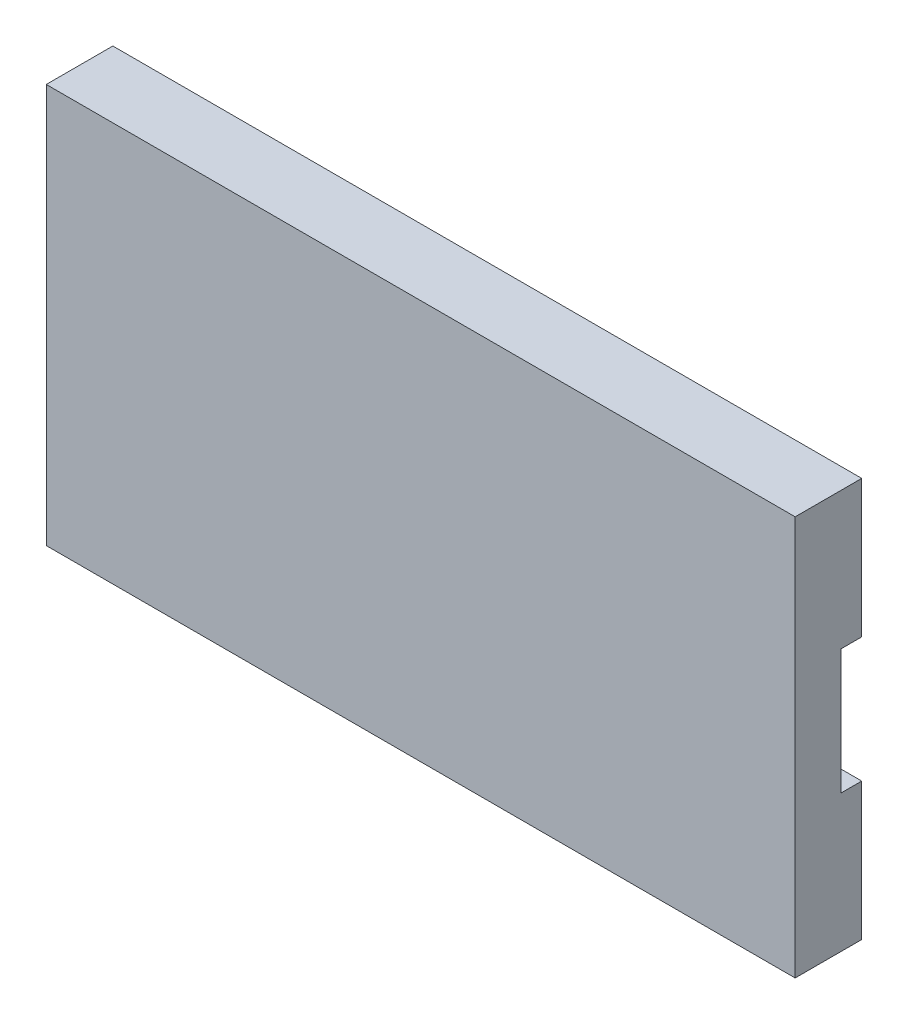
ISO-10303-21;
HEADER;
FILE_DESCRIPTION(('STEP AP214'),'2;1');
FILE_NAME('part.step','',(''),(''),'','','');
FILE_SCHEMA(('AUTOMOTIVE_DESIGN { 1 0 10303 214 1 1 1 1 }'));
ENDSEC;
DATA;
#1=APPLICATION_CONTEXT('core data for automotive mechanical design processes');
#2=APPLICATION_PROTOCOL_DEFINITION('international standard','automotive_design',2000,#1);
#3=PRODUCT_CONTEXT('',#1,'mechanical');
#4=PRODUCT('Part','Part','',(#3));
#5=PRODUCT_RELATED_PRODUCT_CATEGORY('part','',(#4));
#6=PRODUCT_DEFINITION_FORMATION('','',#4);
#7=PRODUCT_DEFINITION_CONTEXT('part definition',#1,'design');
#8=PRODUCT_DEFINITION('design','',#6,#7);
#9=PRODUCT_DEFINITION_SHAPE('','',#8);
#10=(LENGTH_UNIT() NAMED_UNIT(*) SI_UNIT(.MILLI.,.METRE.));
#11=(NAMED_UNIT(*) PLANE_ANGLE_UNIT() SI_UNIT($,.RADIAN.));
#12=(NAMED_UNIT(*) SI_UNIT($,.STERADIAN.) SOLID_ANGLE_UNIT());
#13=UNCERTAINTY_MEASURE_WITH_UNIT(LENGTH_MEASURE(1.E-05),#10,'distance_accuracy_value','');
#14=(GEOMETRIC_REPRESENTATION_CONTEXT(3) GLOBAL_UNCERTAINTY_ASSIGNED_CONTEXT((#13)) GLOBAL_UNIT_ASSIGNED_CONTEXT((#10,
#11,#12)) REPRESENTATION_CONTEXT('',''));
#15=CARTESIAN_POINT('',(0.,0.,0.));
#16=DIRECTION('',(0.,0.,1.));
#17=DIRECTION('',(1.,0.,0.));
#18=AXIS2_PLACEMENT_3D('',#15,#16,#17);
#19=CARTESIAN_POINT('',(45.,24.,8.));
#20=DIRECTION('',(1.,0.,0.));
#21=DIRECTION('',(0.,0.,-1.));
#22=AXIS2_PLACEMENT_3D('',#19,#20,#21);
#23=PLANE('',#22);
#24=DIRECTION('',(0.,-1.,0.));
#25=VECTOR('',#24,1.);
#26=CARTESIAN_POINT('',(45.,24.,0.));
#27=LINE('',#26,#25);
#28=CARTESIAN_POINT('',(45.,-7.49999999999999,0.));
#29=VERTEX_POINT('',#28);
#30=CARTESIAN_POINT('',(45.,-24.,0.));
#31=VERTEX_POINT('',#30);
#32=EDGE_CURVE('E236',#29,#31,#27,.T.);
#33=ORIENTED_EDGE('',*,*,#32,.F.);
#34=DIRECTION('',(0.,0.,1.));
#35=VECTOR('',#34,1.);
#36=CARTESIAN_POINT('',(45.,-7.49999999999999,8.));
#37=LINE('',#36,#35);
#38=CARTESIAN_POINT('',(45.,-7.49999999999999,2.5));
#39=VERTEX_POINT('',#38);
#40=EDGE_CURVE('E162',#29,#39,#37,.T.);
#41=ORIENTED_EDGE('',*,*,#40,.T.);
#42=DIRECTION('',(0.,-1.,0.));
#43=VECTOR('',#42,1.);
#44=CARTESIAN_POINT('',(45.,24.,2.5));
#45=LINE('',#44,#43);
#46=CARTESIAN_POINT('',(45.,7.50000000000001,2.5));
#47=VERTEX_POINT('',#46);
#48=EDGE_CURVE('E11',#47,#39,#45,.T.);
#49=ORIENTED_EDGE('',*,*,#48,.F.);
#50=DIRECTION('',(0.,0.,-1.));
#51=VECTOR('',#50,1.);
#52=CARTESIAN_POINT('',(45.,7.50000000000001,8.));
#53=LINE('',#52,#51);
#54=CARTESIAN_POINT('',(45.,7.50000000000001,0.));
#55=VERTEX_POINT('',#54);
#56=EDGE_CURVE('E139',#47,#55,#53,.T.);
#57=ORIENTED_EDGE('',*,*,#56,.T.);
#58=CARTESIAN_POINT('',(45.,24.,0.));
#59=VERTEX_POINT('',#58);
#60=EDGE_CURVE('E237',#59,#55,#27,.T.);
#61=ORIENTED_EDGE('',*,*,#60,.F.);
#62=DIRECTION('',(0.,0.,-1.));
#63=VECTOR('',#62,1.);
#64=CARTESIAN_POINT('',(45.,24.,8.));
#65=LINE('',#64,#63);
#66=CARTESIAN_POINT('',(45.,24.,8.));
#67=VERTEX_POINT('',#66);
#68=EDGE_CURVE('E243',#67,#59,#65,.T.);
#69=ORIENTED_EDGE('',*,*,#68,.F.);
#70=DIRECTION('',(0.,-1.,0.));
#71=VECTOR('',#70,1.);
#72=CARTESIAN_POINT('',(45.,24.,8.));
#73=LINE('',#72,#71);
#74=CARTESIAN_POINT('',(45.,-24.,8.));
#75=VERTEX_POINT('',#74);
#76=EDGE_CURVE('E223',#67,#75,#73,.T.);
#77=ORIENTED_EDGE('',*,*,#76,.T.);
#78=DIRECTION('',(0.,0.,-1.));
#79=VECTOR('',#78,1.);
#80=CARTESIAN_POINT('',(45.,-24.,8.));
#81=LINE('',#80,#79);
#82=EDGE_CURVE('E245',#75,#31,#81,.T.);
#83=ORIENTED_EDGE('',*,*,#82,.T.);
#84=EDGE_LOOP('',(#33,#41,#49,#57,#61,#69,#77,#83));
#85=FACE_BOUND('',#84,.T.);
#86=ADVANCED_FACE('F44',(#85),#23,.T.);
#87=CARTESIAN_POINT('',(0.,0.,0.));
#88=DIRECTION('',(0.,0.,1.));
#89=DIRECTION('',(1.,0.,0.));
#90=AXIS2_PLACEMENT_3D('',#87,#88,#89);
#91=PLANE('',#90);
#92=CARTESIAN_POINT('',(0.,0.,0.));
#93=DIRECTION('',(0.,0.,-1.));
#94=DIRECTION('',(-1.,0.,0.));
#95=AXIS2_PLACEMENT_3D('',#92,#93,#94);
#96=CIRCLE('',#95,15.);
#97=CARTESIAN_POINT('',(-15.,0.,0.));
#98=VERTEX_POINT('',#97);
#99=EDGE_CURVE('E208',#98,#98,#96,.T.);
#100=ORIENTED_EDGE('',*,*,#99,.F.);
#101=EDGE_LOOP('',(#100));
#102=FACE_BOUND('',#101,.T.);
#103=CARTESIAN_POINT('',(41.,21.,0.));
#104=DIRECTION('',(0.,0.,-1.));
#105=DIRECTION('',(-1.,0.,0.));
#106=AXIS2_PLACEMENT_3D('',#103,#104,#105);
#107=CIRCLE('',#106,1.8);
#108=CARTESIAN_POINT('',(39.2,21.,0.));
#109=VERTEX_POINT('',#108);
#110=EDGE_CURVE('E202',#109,#109,#107,.T.);
#111=ORIENTED_EDGE('',*,*,#110,.F.);
#112=EDGE_LOOP('',(#111));
#113=FACE_BOUND('',#112,.T.);
#114=CARTESIAN_POINT('',(41.,-21.,0.));
#115=DIRECTION('',(0.,0.,1.));
#116=DIRECTION('',(-1.,0.,0.));
#117=AXIS2_PLACEMENT_3D('',#114,#115,#116);
#118=CIRCLE('',#117,1.8);
#119=CARTESIAN_POINT('',(39.2,-21.,0.));
#120=VERTEX_POINT('',#119);
#121=EDGE_CURVE('E196',#120,#120,#118,.T.);
#122=ORIENTED_EDGE('',*,*,#121,.T.);
#123=EDGE_LOOP('',(#122));
#124=FACE_BOUND('',#123,.T.);
#125=CARTESIAN_POINT('',(-41.,-21.,0.));
#126=DIRECTION('',(0.,0.,-1.));
#127=DIRECTION('',(1.,0.,0.));
#128=AXIS2_PLACEMENT_3D('',#125,#126,#127);
#129=CIRCLE('',#128,1.8);
#130=CARTESIAN_POINT('',(-39.2,-21.,0.));
#131=VERTEX_POINT('',#130);
#132=EDGE_CURVE('E190',#131,#131,#129,.T.);
#133=ORIENTED_EDGE('',*,*,#132,.F.);
#134=EDGE_LOOP('',(#133));
#135=FACE_BOUND('',#134,.T.);
#136=CARTESIAN_POINT('',(-41.,21.,0.));
#137=DIRECTION('',(0.,0.,1.));
#138=DIRECTION('',(1.,0.,0.));
#139=AXIS2_PLACEMENT_3D('',#136,#137,#138);
#140=CIRCLE('',#139,1.8);
#141=CARTESIAN_POINT('',(-39.2,21.,0.));
#142=VERTEX_POINT('',#141);
#143=EDGE_CURVE('E186',#142,#142,#140,.T.);
#144=ORIENTED_EDGE('',*,*,#143,.T.);
#145=EDGE_LOOP('',(#144));
#146=FACE_BOUND('',#145,.T.);
#147=DIRECTION('',(1.,0.,0.));
#148=VECTOR('',#147,1.);
#149=CARTESIAN_POINT('',(53.,-7.49999999999998,0.));
#150=LINE('',#149,#148);
#151=CARTESIAN_POINT('',(37.,-7.49999999999999,0.));
#152=VERTEX_POINT('',#151);
#153=EDGE_CURVE('E153',#152,#29,#150,.T.);
#154=ORIENTED_EDGE('',*,*,#153,.T.);
#155=ORIENTED_EDGE('',*,*,#32,.T.);
#156=DIRECTION('',(1.,0.,0.));
#157=VECTOR('',#156,1.);
#158=CARTESIAN_POINT('',(-45.,-24.,0.));
#159=LINE('',#158,#157);
#160=CARTESIAN_POINT('',(-45.,-24.,0.));
#161=VERTEX_POINT('',#160);
#162=EDGE_CURVE('E233',#161,#31,#159,.T.);
#163=ORIENTED_EDGE('',*,*,#162,.F.);
#164=DIRECTION('',(0.,-1.,0.));
#165=VECTOR('',#164,1.);
#166=CARTESIAN_POINT('',(-45.,24.,0.));
#167=LINE('',#166,#165);
#168=CARTESIAN_POINT('',(-45.,-7.5,0.));
#169=VERTEX_POINT('',#168);
#170=EDGE_CURVE('E214',#169,#161,#167,.T.);
#171=ORIENTED_EDGE('',*,*,#170,.F.);
#172=DIRECTION('',(-1.,0.,0.));
#173=VECTOR('',#172,1.);
#174=CARTESIAN_POINT('',(-53.,-7.5,0.));
#175=LINE('',#174,#173);
#176=CARTESIAN_POINT('',(-37.,-7.5,0.));
#177=VERTEX_POINT('',#176);
#178=EDGE_CURVE('E169',#177,#169,#175,.T.);
#179=ORIENTED_EDGE('',*,*,#178,.F.);
#180=DIRECTION('',(0.,-1.,0.));
#181=VECTOR('',#180,1.);
#182=CARTESIAN_POINT('',(-37.,7.5,0.));
#183=LINE('',#182,#181);
#184=CARTESIAN_POINT('',(-37.,7.5,0.));
#185=VERTEX_POINT('',#184);
#186=EDGE_CURVE('E67',#185,#177,#183,.T.);
#187=ORIENTED_EDGE('',*,*,#186,.F.);
#188=DIRECTION('',(-1.,0.,0.));
#189=VECTOR('',#188,1.);
#190=CARTESIAN_POINT('',(0.,7.49999999999999,0.));
#191=LINE('',#190,#189);
#192=CARTESIAN_POINT('',(-45.,7.5,0.));
#193=VERTEX_POINT('',#192);
#194=EDGE_CURVE('E251',#185,#193,#191,.T.);
#195=ORIENTED_EDGE('',*,*,#194,.T.);
#196=CARTESIAN_POINT('',(-45.,24.,0.));
#197=VERTEX_POINT('',#196);
#198=EDGE_CURVE('E230',#197,#193,#167,.T.);
#199=ORIENTED_EDGE('',*,*,#198,.F.);
#200=DIRECTION('',(1.,0.,0.));
#201=VECTOR('',#200,1.);
#202=CARTESIAN_POINT('',(-45.,24.,0.));
#203=LINE('',#202,#201);
#204=EDGE_CURVE('E221',#197,#59,#203,.T.);
#205=ORIENTED_EDGE('',*,*,#204,.T.);
#206=ORIENTED_EDGE('',*,*,#60,.T.);
#207=DIRECTION('',(1.,0.,0.));
#208=VECTOR('',#207,1.);
#209=CARTESIAN_POINT('',(0.,7.49999999999999,0.));
#210=LINE('',#209,#208);
#211=CARTESIAN_POINT('',(37.,7.50000000000001,0.));
#212=VERTEX_POINT('',#211);
#213=EDGE_CURVE('E52',#212,#55,#210,.T.);
#214=ORIENTED_EDGE('',*,*,#213,.F.);
#215=DIRECTION('',(0.,-1.,0.));
#216=VECTOR('',#215,1.);
#217=CARTESIAN_POINT('',(37.,7.50000000000001,0.));
#218=LINE('',#217,#216);
#219=EDGE_CURVE('E59',#212,#152,#218,.T.);
#220=ORIENTED_EDGE('',*,*,#219,.T.);
#221=EDGE_LOOP('',(#154,#155,#163,#171,#179,#187,#195,#199,#205,#206,#214,#220));
#222=FACE_BOUND('',#221,.T.);
#223=ADVANCED_FACE('F260',(#102,#113,#124,#135,#146,#222),#91,.F.);
#224=CARTESIAN_POINT('',(-45.,24.,8.));
#225=DIRECTION('',(1.,0.,0.));
#226=DIRECTION('',(0.,1.,0.));
#227=AXIS2_PLACEMENT_3D('',#224,#225,#226);
#228=PLANE('',#227);
#229=ORIENTED_EDGE('',*,*,#198,.T.);
#230=DIRECTION('',(0.,0.,1.));
#231=VECTOR('',#230,1.);
#232=CARTESIAN_POINT('',(-45.,7.5,8.));
#233=LINE('',#232,#231);
#234=CARTESIAN_POINT('',(-45.,7.5,2.5));
#235=VERTEX_POINT('',#234);
#236=EDGE_CURVE('E183',#193,#235,#233,.T.);
#237=ORIENTED_EDGE('',*,*,#236,.T.);
#238=DIRECTION('',(0.,-1.,0.));
#239=VECTOR('',#238,1.);
#240=CARTESIAN_POINT('',(-45.,24.,2.5));
#241=LINE('',#240,#239);
#242=CARTESIAN_POINT('',(-45.,-7.5,2.5));
#243=VERTEX_POINT('',#242);
#244=EDGE_CURVE('E254',#235,#243,#241,.T.);
#245=ORIENTED_EDGE('',*,*,#244,.T.);
#246=DIRECTION('',(0.,0.,-1.));
#247=VECTOR('',#246,1.);
#248=CARTESIAN_POINT('',(-45.,-7.5,8.));
#249=LINE('',#248,#247);
#250=EDGE_CURVE('E179',#243,#169,#249,.T.);
#251=ORIENTED_EDGE('',*,*,#250,.T.);
#252=ORIENTED_EDGE('',*,*,#170,.T.);
#253=DIRECTION('',(0.,0.,-1.));
#254=VECTOR('',#253,1.);
#255=CARTESIAN_POINT('',(-45.,-24.,8.));
#256=LINE('',#255,#254);
#257=CARTESIAN_POINT('',(-45.,-24.,8.));
#258=VERTEX_POINT('',#257);
#259=EDGE_CURVE('E248',#258,#161,#256,.T.);
#260=ORIENTED_EDGE('',*,*,#259,.F.);
#261=DIRECTION('',(0.,-1.,0.));
#262=VECTOR('',#261,1.);
#263=CARTESIAN_POINT('',(-45.,24.,8.));
#264=LINE('',#263,#262);
#265=CARTESIAN_POINT('',(-45.,24.,8.));
#266=VERTEX_POINT('',#265);
#267=EDGE_CURVE('E217',#266,#258,#264,.T.);
#268=ORIENTED_EDGE('',*,*,#267,.F.);
#269=DIRECTION('',(0.,0.,-1.));
#270=VECTOR('',#269,1.);
#271=CARTESIAN_POINT('',(-45.,24.,8.));
#272=LINE('',#271,#270);
#273=EDGE_CURVE('E229',#266,#197,#272,.T.);
#274=ORIENTED_EDGE('',*,*,#273,.T.);
#275=EDGE_LOOP('',(#229,#237,#245,#251,#252,#260,#268,#274));
#276=FACE_BOUND('',#275,.T.);
#277=ADVANCED_FACE('F46',(#276),#228,.F.);
#278=CARTESIAN_POINT('',(-45.,-24.,8.));
#279=DIRECTION('',(0.,1.,0.));
#280=DIRECTION('',(0.,0.,1.));
#281=AXIS2_PLACEMENT_3D('',#278,#279,#280);
#282=PLANE('',#281);
#283=ORIENTED_EDGE('',*,*,#162,.T.);
#284=ORIENTED_EDGE('',*,*,#82,.F.);
#285=DIRECTION('',(1.,0.,0.));
#286=VECTOR('',#285,1.);
#287=CARTESIAN_POINT('',(-45.,-24.,8.));
#288=LINE('',#287,#286);
#289=EDGE_CURVE('E220',#258,#75,#288,.T.);
#290=ORIENTED_EDGE('',*,*,#289,.F.);
#291=ORIENTED_EDGE('',*,*,#259,.T.);
#292=EDGE_LOOP('',(#283,#284,#290,#291));
#293=FACE_BOUND('',#292,.T.);
#294=ADVANCED_FACE('F273',(#293),#282,.F.);
#295=CARTESIAN_POINT('',(-45.,24.,8.));
#296=DIRECTION('',(0.,1.,0.));
#297=DIRECTION('',(0.,0.,1.));
#298=AXIS2_PLACEMENT_3D('',#295,#296,#297);
#299=PLANE('',#298);
#300=ORIENTED_EDGE('',*,*,#204,.F.);
#301=ORIENTED_EDGE('',*,*,#273,.F.);
#302=DIRECTION('',(1.,0.,0.));
#303=VECTOR('',#302,1.);
#304=CARTESIAN_POINT('',(-45.,24.,8.));
#305=LINE('',#304,#303);
#306=EDGE_CURVE('E226',#266,#67,#305,.T.);
#307=ORIENTED_EDGE('',*,*,#306,.T.);
#308=ORIENTED_EDGE('',*,*,#68,.T.);
#309=EDGE_LOOP('',(#300,#301,#307,#308));
#310=FACE_BOUND('',#309,.T.);
#311=ADVANCED_FACE('F264',(#310),#299,.T.);
#312=CARTESIAN_POINT('',(0.,0.,8.));
#313=DIRECTION('',(0.,0.,1.));
#314=DIRECTION('',(1.,0.,0.));
#315=AXIS2_PLACEMENT_3D('',#312,#313,#314);
#316=PLANE('',#315);
#317=ORIENTED_EDGE('',*,*,#267,.T.);
#318=ORIENTED_EDGE('',*,*,#289,.T.);
#319=ORIENTED_EDGE('',*,*,#76,.F.);
#320=ORIENTED_EDGE('',*,*,#306,.F.);
#321=EDGE_LOOP('',(#317,#318,#319,#320));
#322=FACE_BOUND('',#321,.T.);
#323=ADVANCED_FACE('F269',(#322),#316,.T.);
#324=CARTESIAN_POINT('',(0.,0.,3.));
#325=DIRECTION('',(0.,0.,-1.));
#326=DIRECTION('',(-1.,0.,0.));
#327=AXIS2_PLACEMENT_3D('',#324,#325,#326);
#328=CYLINDRICAL_SURFACE('',#327,15.);
#329=CARTESIAN_POINT('',(0.,0.,3.));
#330=DIRECTION('',(0.,0.,-1.));
#331=DIRECTION('',(-1.,0.,0.));
#332=AXIS2_PLACEMENT_3D('',#329,#330,#331);
#333=CIRCLE('',#332,15.);
#334=CARTESIAN_POINT('',(-15.,0.,3.));
#335=VERTEX_POINT('',#334);
#336=EDGE_CURVE('E211',#335,#335,#333,.T.);
#337=ORIENTED_EDGE('',*,*,#336,.F.);
#338=EDGE_LOOP('',(#337));
#339=FACE_BOUND('',#338,.T.);
#340=ORIENTED_EDGE('',*,*,#99,.T.);
#341=EDGE_LOOP('',(#340));
#342=FACE_BOUND('',#341,.T.);
#343=ADVANCED_FACE('F361',(#339,#342),#328,.F.);
#344=CARTESIAN_POINT('',(0.,0.,3.));
#345=DIRECTION('',(0.,0.,-1.));
#346=DIRECTION('',(-1.,0.,0.));
#347=AXIS2_PLACEMENT_3D('',#344,#345,#346);
#348=PLANE('',#347);
#349=ORIENTED_EDGE('',*,*,#336,.T.);
#350=EDGE_LOOP('',(#349));
#351=FACE_BOUND('',#350,.T.);
#352=ADVANCED_FACE('F357',(#351),#348,.T.);
#353=CARTESIAN_POINT('',(41.,21.,3.));
#354=DIRECTION('',(0.,0.,-1.));
#355=DIRECTION('',(-1.,0.,0.));
#356=AXIS2_PLACEMENT_3D('',#353,#354,#355);
#357=CYLINDRICAL_SURFACE('',#356,1.8);
#358=CARTESIAN_POINT('',(41.,21.,3.));
#359=DIRECTION('',(0.,0.,-1.));
#360=DIRECTION('',(-1.,0.,0.));
#361=AXIS2_PLACEMENT_3D('',#358,#359,#360);
#362=CIRCLE('',#361,1.8);
#363=CARTESIAN_POINT('',(39.2,21.,3.));
#364=VERTEX_POINT('',#363);
#365=EDGE_CURVE('E205',#364,#364,#362,.T.);
#366=ORIENTED_EDGE('',*,*,#365,.F.);
#367=EDGE_LOOP('',(#366));
#368=FACE_BOUND('',#367,.T.);
#369=ORIENTED_EDGE('',*,*,#110,.T.);
#370=EDGE_LOOP('',(#369));
#371=FACE_BOUND('',#370,.T.);
#372=ADVANCED_FACE('F353',(#368,#371),#357,.F.);
#373=CARTESIAN_POINT('',(41.,21.,3.));
#374=DIRECTION('',(0.,0.,-1.));
#375=DIRECTION('',(-1.,0.,0.));
#376=AXIS2_PLACEMENT_3D('',#373,#374,#375);
#377=PLANE('',#376);
#378=ORIENTED_EDGE('',*,*,#365,.T.);
#379=EDGE_LOOP('',(#378));
#380=FACE_BOUND('',#379,.T.);
#381=ADVANCED_FACE('F349',(#380),#377,.T.);
#382=CARTESIAN_POINT('',(41.,-21.,3.));
#383=DIRECTION('',(0.,0.,-1.));
#384=DIRECTION('',(-1.,0.,0.));
#385=AXIS2_PLACEMENT_3D('',#382,#383,#384);
#386=CYLINDRICAL_SURFACE('',#385,1.8);
#387=CARTESIAN_POINT('',(41.,-21.,3.));
#388=DIRECTION('',(0.,0.,1.));
#389=DIRECTION('',(-1.,0.,0.));
#390=AXIS2_PLACEMENT_3D('',#387,#388,#389);
#391=CIRCLE('',#390,1.8);
#392=CARTESIAN_POINT('',(39.2,-21.,3.));
#393=VERTEX_POINT('',#392);
#394=EDGE_CURVE('E199',#393,#393,#391,.T.);
#395=ORIENTED_EDGE('',*,*,#394,.T.);
#396=EDGE_LOOP('',(#395));
#397=FACE_BOUND('',#396,.T.);
#398=ORIENTED_EDGE('',*,*,#121,.F.);
#399=EDGE_LOOP('',(#398));
#400=FACE_BOUND('',#399,.T.);
#401=ADVANCED_FACE('F345',(#397,#400),#386,.F.);
#402=CARTESIAN_POINT('',(41.,-21.,3.));
#403=DIRECTION('',(0.,0.,-1.));
#404=DIRECTION('',(-1.,0.,0.));
#405=AXIS2_PLACEMENT_3D('',#402,#403,#404);
#406=PLANE('',#405);
#407=ORIENTED_EDGE('',*,*,#394,.F.);
#408=EDGE_LOOP('',(#407));
#409=FACE_BOUND('',#408,.T.);
#410=ADVANCED_FACE('F341',(#409),#406,.T.);
#411=CARTESIAN_POINT('',(-41.,-21.,3.));
#412=DIRECTION('',(0.,0.,-1.));
#413=DIRECTION('',(-1.,0.,0.));
#414=AXIS2_PLACEMENT_3D('',#411,#412,#413);
#415=CYLINDRICAL_SURFACE('',#414,1.8);
#416=CARTESIAN_POINT('',(-41.,-21.,3.));
#417=DIRECTION('',(0.,0.,-1.));
#418=DIRECTION('',(1.,0.,0.));
#419=AXIS2_PLACEMENT_3D('',#416,#417,#418);
#420=CIRCLE('',#419,1.8);
#421=CARTESIAN_POINT('',(-39.2,-21.,3.));
#422=VERTEX_POINT('',#421);
#423=EDGE_CURVE('E193',#422,#422,#420,.T.);
#424=ORIENTED_EDGE('',*,*,#423,.F.);
#425=EDGE_LOOP('',(#424));
#426=FACE_BOUND('',#425,.T.);
#427=ORIENTED_EDGE('',*,*,#132,.T.);
#428=EDGE_LOOP('',(#427));
#429=FACE_BOUND('',#428,.T.);
#430=ADVANCED_FACE('F337',(#426,#429),#415,.F.);
#431=CARTESIAN_POINT('',(-41.,-21.,3.));
#432=DIRECTION('',(0.,0.,-1.));
#433=DIRECTION('',(1.,0.,0.));
#434=AXIS2_PLACEMENT_3D('',#431,#432,#433);
#435=PLANE('',#434);
#436=ORIENTED_EDGE('',*,*,#423,.T.);
#437=EDGE_LOOP('',(#436));
#438=FACE_BOUND('',#437,.T.);
#439=ADVANCED_FACE('F333',(#438),#435,.T.);
#440=CARTESIAN_POINT('',(-41.,21.,3.));
#441=DIRECTION('',(0.,0.,-1.));
#442=DIRECTION('',(-1.,0.,0.));
#443=AXIS2_PLACEMENT_3D('',#440,#441,#442);
#444=CYLINDRICAL_SURFACE('',#443,1.8);
#445=CARTESIAN_POINT('',(-41.,21.,3.));
#446=DIRECTION('',(0.,0.,1.));
#447=DIRECTION('',(1.,0.,0.));
#448=AXIS2_PLACEMENT_3D('',#445,#446,#447);
#449=CIRCLE('',#448,1.8);
#450=CARTESIAN_POINT('',(-39.2,21.,3.));
#451=VERTEX_POINT('',#450);
#452=EDGE_CURVE('E187',#451,#451,#449,.T.);
#453=ORIENTED_EDGE('',*,*,#452,.T.);
#454=EDGE_LOOP('',(#453));
#455=FACE_BOUND('',#454,.T.);
#456=ORIENTED_EDGE('',*,*,#143,.F.);
#457=EDGE_LOOP('',(#456));
#458=FACE_BOUND('',#457,.T.);
#459=ADVANCED_FACE('F329',(#455,#458),#444,.F.);
#460=CARTESIAN_POINT('',(-41.,21.,3.));
#461=DIRECTION('',(0.,0.,-1.));
#462=DIRECTION('',(1.,0.,0.));
#463=AXIS2_PLACEMENT_3D('',#460,#461,#462);
#464=PLANE('',#463);
#465=ORIENTED_EDGE('',*,*,#452,.F.);
#466=EDGE_LOOP('',(#465));
#467=FACE_BOUND('',#466,.T.);
#468=ADVANCED_FACE('F322',(#467),#464,.T.);
#469=CARTESIAN_POINT('',(0.,0.,2.5));
#470=DIRECTION('',(0.,0.,1.));
#471=DIRECTION('',(1.,0.,0.));
#472=AXIS2_PLACEMENT_3D('',#469,#470,#471);
#473=PLANE('',#472);
#474=DIRECTION('',(1.,0.,0.));
#475=VECTOR('',#474,1.);
#476=CARTESIAN_POINT('',(-53.,7.5,2.5));
#477=LINE('',#476,#475);
#478=CARTESIAN_POINT('',(-37.,7.5,2.5));
#479=VERTEX_POINT('',#478);
#480=EDGE_CURVE('E172',#235,#479,#477,.T.);
#481=ORIENTED_EDGE('',*,*,#480,.T.);
#482=DIRECTION('',(0.,-1.,0.));
#483=VECTOR('',#482,1.);
#484=CARTESIAN_POINT('',(-37.,7.5,2.5));
#485=LINE('',#484,#483);
#486=CARTESIAN_POINT('',(-37.,-7.5,2.5));
#487=VERTEX_POINT('',#486);
#488=EDGE_CURVE('E165',#479,#487,#485,.T.);
#489=ORIENTED_EDGE('',*,*,#488,.T.);
#490=DIRECTION('',(-1.,0.,0.));
#491=VECTOR('',#490,1.);
#492=CARTESIAN_POINT('',(-53.,-7.5,2.5));
#493=LINE('',#492,#491);
#494=EDGE_CURVE('E168',#487,#243,#493,.T.);
#495=ORIENTED_EDGE('',*,*,#494,.T.);
#496=ORIENTED_EDGE('',*,*,#244,.F.);
#497=EDGE_LOOP('',(#481,#489,#495,#496));
#498=FACE_BOUND('',#497,.T.);
#499=ADVANCED_FACE('F311',(#498),#473,.F.);
#500=CARTESIAN_POINT('',(-53.,7.5,2.5));
#501=DIRECTION('',(0.,1.,0.));
#502=DIRECTION('',(-1.,0.,0.));
#503=AXIS2_PLACEMENT_3D('',#500,#501,#502);
#504=PLANE('',#503);
#505=ORIENTED_EDGE('',*,*,#194,.F.);
#506=DIRECTION('',(0.,0.,-1.));
#507=VECTOR('',#506,1.);
#508=CARTESIAN_POINT('',(-37.,7.5,2.5));
#509=LINE('',#508,#507);
#510=EDGE_CURVE('E177',#479,#185,#509,.T.);
#511=ORIENTED_EDGE('',*,*,#510,.F.);
#512=ORIENTED_EDGE('',*,*,#480,.F.);
#513=ORIENTED_EDGE('',*,*,#236,.F.);
#514=EDGE_LOOP('',(#505,#511,#512,#513));
#515=FACE_BOUND('',#514,.T.);
#516=ADVANCED_FACE('F314',(#515),#504,.F.);
#517=CARTESIAN_POINT('',(-53.,-7.5,2.5));
#518=DIRECTION('',(0.,-1.,0.));
#519=DIRECTION('',(1.,0.,0.));
#520=AXIS2_PLACEMENT_3D('',#517,#518,#519);
#521=PLANE('',#520);
#522=ORIENTED_EDGE('',*,*,#494,.F.);
#523=DIRECTION('',(0.,0.,-1.));
#524=VECTOR('',#523,1.);
#525=CARTESIAN_POINT('',(-37.,-7.5,2.5));
#526=LINE('',#525,#524);
#527=EDGE_CURVE('E174',#487,#177,#526,.T.);
#528=ORIENTED_EDGE('',*,*,#527,.T.);
#529=ORIENTED_EDGE('',*,*,#178,.T.);
#530=ORIENTED_EDGE('',*,*,#250,.F.);
#531=EDGE_LOOP('',(#522,#528,#529,#530));
#532=FACE_BOUND('',#531,.T.);
#533=ADVANCED_FACE('F307',(#532),#521,.F.);
#534=CARTESIAN_POINT('',(-37.,7.5,2.5));
#535=DIRECTION('',(1.,0.,0.));
#536=DIRECTION('',(0.,0.,-1.));
#537=AXIS2_PLACEMENT_3D('',#534,#535,#536);
#538=PLANE('',#537);
#539=ORIENTED_EDGE('',*,*,#186,.T.);
#540=ORIENTED_EDGE('',*,*,#527,.F.);
#541=ORIENTED_EDGE('',*,*,#488,.F.);
#542=ORIENTED_EDGE('',*,*,#510,.T.);
#543=EDGE_LOOP('',(#539,#540,#541,#542));
#544=FACE_BOUND('',#543,.T.);
#545=ADVANCED_FACE('F285',(#544),#538,.F.);
#546=CARTESIAN_POINT('',(37.,7.50000000000001,2.5));
#547=DIRECTION('',(1.,0.,0.));
#548=DIRECTION('',(0.,1.,0.));
#549=AXIS2_PLACEMENT_3D('',#546,#547,#548);
#550=PLANE('',#549);
#551=ORIENTED_EDGE('',*,*,#219,.F.);
#552=DIRECTION('',(0.,0.,-1.));
#553=VECTOR('',#552,1.);
#554=CARTESIAN_POINT('',(37.,7.50000000000001,2.5));
#555=LINE('',#554,#553);
#556=CARTESIAN_POINT('',(37.,7.50000000000001,2.5));
#557=VERTEX_POINT('',#556);
#558=EDGE_CURVE('E136',#557,#212,#555,.T.);
#559=ORIENTED_EDGE('',*,*,#558,.F.);
#560=DIRECTION('',(0.,-1.,0.));
#561=VECTOR('',#560,1.);
#562=CARTESIAN_POINT('',(37.,7.50000000000001,2.5));
#563=LINE('',#562,#561);
#564=CARTESIAN_POINT('',(37.,-7.49999999999999,2.5));
#565=VERTEX_POINT('',#564);
#566=EDGE_CURVE('E144',#557,#565,#563,.T.);
#567=ORIENTED_EDGE('',*,*,#566,.T.);
#568=DIRECTION('',(0.,0.,-1.));
#569=VECTOR('',#568,1.);
#570=CARTESIAN_POINT('',(37.,-7.49999999999999,2.5));
#571=LINE('',#570,#569);
#572=EDGE_CURVE('E149',#565,#152,#571,.T.);
#573=ORIENTED_EDGE('',*,*,#572,.T.);
#574=EDGE_LOOP('',(#551,#559,#567,#573));
#575=FACE_BOUND('',#574,.T.);
#576=ADVANCED_FACE('F147',(#575),#550,.T.);
#577=CARTESIAN_POINT('',(53.,-7.49999999999998,2.5));
#578=DIRECTION('',(0.,1.,0.));
#579=DIRECTION('',(-1.,0.,0.));
#580=AXIS2_PLACEMENT_3D('',#577,#578,#579);
#581=PLANE('',#580);
#582=ORIENTED_EDGE('',*,*,#153,.F.);
#583=ORIENTED_EDGE('',*,*,#572,.F.);
#584=DIRECTION('',(1.,0.,0.));
#585=VECTOR('',#584,1.);
#586=CARTESIAN_POINT('',(53.,-7.49999999999998,2.5));
#587=LINE('',#586,#585);
#588=EDGE_CURVE('E143',#565,#39,#587,.T.);
#589=ORIENTED_EDGE('',*,*,#588,.T.);
#590=ORIENTED_EDGE('',*,*,#40,.F.);
#591=EDGE_LOOP('',(#582,#583,#589,#590));
#592=FACE_BOUND('',#591,.T.);
#593=ADVANCED_FACE('F277',(#592),#581,.T.);
#594=CARTESIAN_POINT('',(53.,7.50000000000001,2.5));
#595=DIRECTION('',(0.,-1.,0.));
#596=DIRECTION('',(1.,0.,0.));
#597=AXIS2_PLACEMENT_3D('',#594,#595,#596);
#598=PLANE('',#597);
#599=DIRECTION('',(-1.,0.,0.));
#600=VECTOR('',#599,1.);
#601=CARTESIAN_POINT('',(53.,7.50000000000001,2.5));
#602=LINE('',#601,#600);
#603=EDGE_CURVE('E134',#47,#557,#602,.T.);
#604=ORIENTED_EDGE('',*,*,#603,.T.);
#605=ORIENTED_EDGE('',*,*,#558,.T.);
#606=ORIENTED_EDGE('',*,*,#213,.T.);
#607=ORIENTED_EDGE('',*,*,#56,.F.);
#608=EDGE_LOOP('',(#604,#605,#606,#607));
#609=FACE_BOUND('',#608,.T.);
#610=ADVANCED_FACE('F135',(#609),#598,.T.);
#611=CARTESIAN_POINT('',(0.,0.,2.5));
#612=DIRECTION('',(0.,0.,1.));
#613=DIRECTION('',(-1.,0.,0.));
#614=AXIS2_PLACEMENT_3D('',#611,#612,#613);
#615=PLANE('',#614);
#616=ORIENTED_EDGE('',*,*,#48,.T.);
#617=ORIENTED_EDGE('',*,*,#588,.F.);
#618=ORIENTED_EDGE('',*,*,#566,.F.);
#619=ORIENTED_EDGE('',*,*,#603,.F.);
#620=EDGE_LOOP('',(#616,#617,#618,#619));
#621=FACE_BOUND('',#620,.T.);
#622=ADVANCED_FACE('F151',(#621),#615,.F.);
#623=CLOSED_SHELL('',(#86,#223,#277,#294,#311,#323,#343,#352,#372,#381,#401,#410,#430,#439,#459,
#468,#499,#516,#533,#545,#576,#593,#610,#622));
#624=MANIFOLD_SOLID_BREP('B2',#623);
#625=ADVANCED_BREP_SHAPE_REPRESENTATION('',(#18,#624),#14);
#626=SHAPE_DEFINITION_REPRESENTATION(#9,#625);
ENDSEC;
END-ISO-10303-21;
